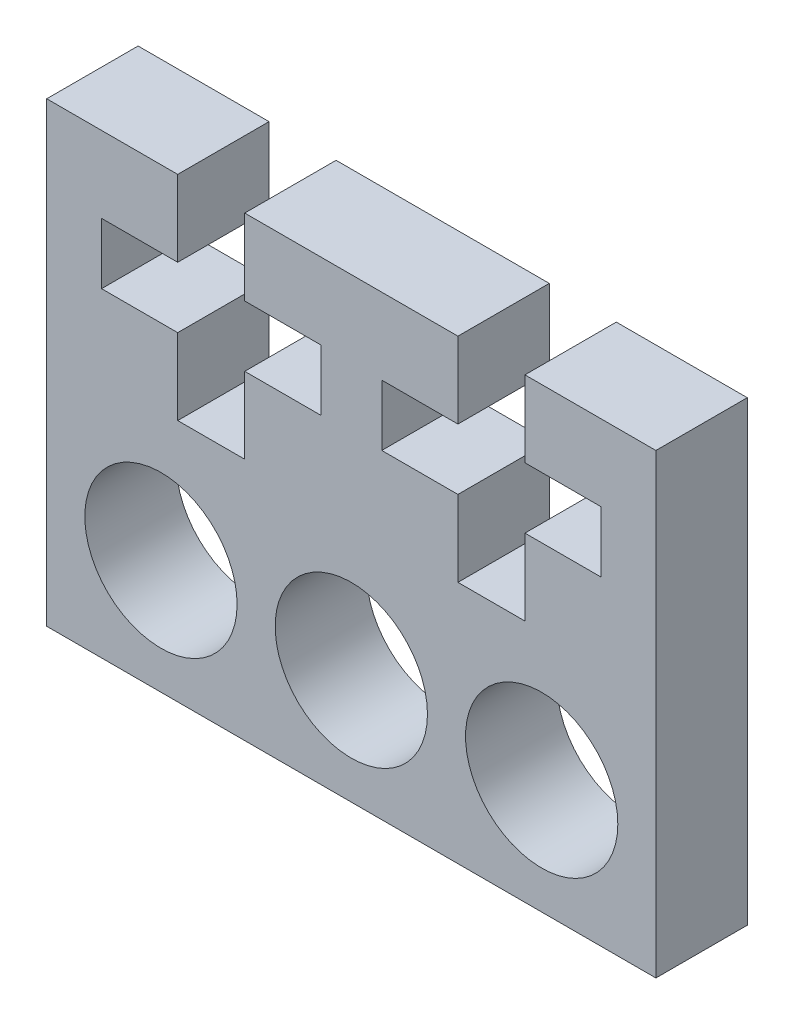
ISO-10303-21;
HEADER;
FILE_DESCRIPTION(('STEP AP214'),'2;1');
FILE_NAME('part.step','',(''),(''),'','','');
FILE_SCHEMA(('AUTOMOTIVE_DESIGN { 1 0 10303 214 1 1 1 1 }'));
ENDSEC;
DATA;
#1=APPLICATION_CONTEXT('core data for automotive mechanical design processes');
#2=APPLICATION_PROTOCOL_DEFINITION('international standard','automotive_design',2000,#1);
#3=PRODUCT_CONTEXT('',#1,'mechanical');
#4=PRODUCT('Part','Part','',(#3));
#5=PRODUCT_RELATED_PRODUCT_CATEGORY('part','',(#4));
#6=PRODUCT_DEFINITION_FORMATION('','',#4);
#7=PRODUCT_DEFINITION_CONTEXT('part definition',#1,'design');
#8=PRODUCT_DEFINITION('design','',#6,#7);
#9=PRODUCT_DEFINITION_SHAPE('','',#8);
#10=(LENGTH_UNIT() NAMED_UNIT(*) SI_UNIT(.MILLI.,.METRE.));
#11=(NAMED_UNIT(*) PLANE_ANGLE_UNIT() SI_UNIT($,.RADIAN.));
#12=(NAMED_UNIT(*) SI_UNIT($,.STERADIAN.) SOLID_ANGLE_UNIT());
#13=UNCERTAINTY_MEASURE_WITH_UNIT(LENGTH_MEASURE(1.E-05),#10,'distance_accuracy_value','');
#14=(GEOMETRIC_REPRESENTATION_CONTEXT(3) GLOBAL_UNCERTAINTY_ASSIGNED_CONTEXT((#13)) GLOBAL_UNIT_ASSIGNED_CONTEXT((#10,
#11,#12)) REPRESENTATION_CONTEXT('',''));
#15=CARTESIAN_POINT('',(0.,0.,0.));
#16=DIRECTION('',(0.,0.,1.));
#17=DIRECTION('',(1.,0.,0.));
#18=AXIS2_PLACEMENT_3D('',#15,#16,#17);
#19=CARTESIAN_POINT('',(0.,7.50000000000001,3.));
#20=DIRECTION('',(0.,1.,0.));
#21=DIRECTION('',(-1.,0.,0.));
#22=AXIS2_PLACEMENT_3D('',#19,#20,#21);
#23=PLANE('',#22);
#24=DIRECTION('',(1.,0.,0.));
#25=VECTOR('',#24,1.);
#26=CARTESIAN_POINT('',(0.,7.50000000000001,0.));
#27=LINE('',#26,#25);
#28=CARTESIAN_POINT('',(5.7,7.5,0.));
#29=VERTEX_POINT('',#28);
#30=CARTESIAN_POINT('',(10.,7.5,0.));
#31=VERTEX_POINT('',#30);
#32=EDGE_CURVE('E263',#29,#31,#27,.T.);
#33=ORIENTED_EDGE('',*,*,#32,.F.);
#34=DIRECTION('',(0.,0.,-1.));
#35=VECTOR('',#34,1.);
#36=CARTESIAN_POINT('',(5.7,7.5,3.));
#37=LINE('',#36,#35);
#38=CARTESIAN_POINT('',(5.7,7.5,3.));
#39=VERTEX_POINT('',#38);
#40=EDGE_CURVE('E11',#39,#29,#37,.T.);
#41=ORIENTED_EDGE('',*,*,#40,.F.);
#42=DIRECTION('',(1.,0.,0.));
#43=VECTOR('',#42,1.);
#44=CARTESIAN_POINT('',(0.,7.50000000000001,3.));
#45=LINE('',#44,#43);
#46=CARTESIAN_POINT('',(10.,7.5,3.));
#47=VERTEX_POINT('',#46);
#48=EDGE_CURVE('E830',#39,#47,#45,.T.);
#49=ORIENTED_EDGE('',*,*,#48,.T.);
#50=DIRECTION('',(0.,0.,-1.));
#51=VECTOR('',#50,1.);
#52=CARTESIAN_POINT('',(10.,7.5,3.));
#53=LINE('',#52,#51);
#54=EDGE_CURVE('E147',#47,#31,#53,.T.);
#55=ORIENTED_EDGE('',*,*,#54,.T.);
#56=EDGE_LOOP('',(#33,#41,#49,#55));
#57=FACE_BOUND('',#56,.T.);
#58=ADVANCED_FACE('F35',(#57),#23,.T.);
#59=CARTESIAN_POINT('',(5.7,0.,3.));
#60=DIRECTION('',(1.,0.,0.));
#61=DIRECTION('',(0.,0.,-1.));
#62=AXIS2_PLACEMENT_3D('',#59,#60,#61);
#63=PLANE('',#62);
#64=DIRECTION('',(0.,-1.,0.));
#65=VECTOR('',#64,1.);
#66=CARTESIAN_POINT('',(5.7,0.,0.));
#67=LINE('',#66,#65);
#68=CARTESIAN_POINT('',(5.7,5.,0.));
#69=VERTEX_POINT('',#68);
#70=EDGE_CURVE('E265',#29,#69,#67,.T.);
#71=ORIENTED_EDGE('',*,*,#70,.T.);
#72=DIRECTION('',(0.,0.,-1.));
#73=VECTOR('',#72,1.);
#74=CARTESIAN_POINT('',(5.7,5.,3.));
#75=LINE('',#74,#73);
#76=CARTESIAN_POINT('',(5.7,5.,3.));
#77=VERTEX_POINT('',#76);
#78=EDGE_CURVE('E44',#77,#69,#75,.T.);
#79=ORIENTED_EDGE('',*,*,#78,.F.);
#80=DIRECTION('',(0.,-1.,0.));
#81=VECTOR('',#80,1.);
#82=CARTESIAN_POINT('',(5.7,0.,3.));
#83=LINE('',#82,#81);
#84=EDGE_CURVE('E743',#39,#77,#83,.T.);
#85=ORIENTED_EDGE('',*,*,#84,.F.);
#86=ORIENTED_EDGE('',*,*,#40,.T.);
#87=EDGE_LOOP('',(#71,#79,#85,#86));
#88=FACE_BOUND('',#87,.T.);
#89=ADVANCED_FACE('F407',(#88),#63,.F.);
#90=CARTESIAN_POINT('',(0.,5.,3.));
#91=DIRECTION('',(0.,1.,0.));
#92=DIRECTION('',(0.,0.,1.));
#93=AXIS2_PLACEMENT_3D('',#90,#91,#92);
#94=PLANE('',#93);
#95=DIRECTION('',(1.,0.,0.));
#96=VECTOR('',#95,1.);
#97=CARTESIAN_POINT('',(0.,5.,0.));
#98=LINE('',#97,#96);
#99=CARTESIAN_POINT('',(8.2,5.,0.));
#100=VERTEX_POINT('',#99);
#101=EDGE_CURVE('E268',#69,#100,#98,.T.);
#102=ORIENTED_EDGE('',*,*,#101,.T.);
#103=DIRECTION('',(0.,0.,-1.));
#104=VECTOR('',#103,1.);
#105=CARTESIAN_POINT('',(8.2,5.,3.));
#106=LINE('',#105,#104);
#107=CARTESIAN_POINT('',(8.2,5.,3.));
#108=VERTEX_POINT('',#107);
#109=EDGE_CURVE('E395',#108,#100,#106,.T.);
#110=ORIENTED_EDGE('',*,*,#109,.F.);
#111=DIRECTION('',(1.,0.,0.));
#112=VECTOR('',#111,1.);
#113=CARTESIAN_POINT('',(0.,5.,3.));
#114=LINE('',#113,#112);
#115=EDGE_CURVE('E403',#77,#108,#114,.T.);
#116=ORIENTED_EDGE('',*,*,#115,.F.);
#117=ORIENTED_EDGE('',*,*,#78,.T.);
#118=EDGE_LOOP('',(#102,#110,#116,#117));
#119=FACE_BOUND('',#118,.T.);
#120=ADVANCED_FACE('F400',(#119),#94,.F.);
#121=CARTESIAN_POINT('',(8.2,0.,3.));
#122=DIRECTION('',(1.,0.,0.));
#123=DIRECTION('',(0.,0.,-1.));
#124=AXIS2_PLACEMENT_3D('',#121,#122,#123);
#125=PLANE('',#124);
#126=DIRECTION('',(0.,-1.,0.));
#127=VECTOR('',#126,1.);
#128=CARTESIAN_POINT('',(8.2,0.,0.));
#129=LINE('',#128,#127);
#130=CARTESIAN_POINT('',(8.2,3.,0.));
#131=VERTEX_POINT('',#130);
#132=EDGE_CURVE('E271',#100,#131,#129,.T.);
#133=ORIENTED_EDGE('',*,*,#132,.T.);
#134=DIRECTION('',(0.,0.,-1.));
#135=VECTOR('',#134,1.);
#136=CARTESIAN_POINT('',(8.2,3.,3.));
#137=LINE('',#136,#135);
#138=CARTESIAN_POINT('',(8.2,3.,3.));
#139=VERTEX_POINT('',#138);
#140=EDGE_CURVE('E392',#139,#131,#137,.T.);
#141=ORIENTED_EDGE('',*,*,#140,.F.);
#142=DIRECTION('',(0.,-1.,0.));
#143=VECTOR('',#142,1.);
#144=CARTESIAN_POINT('',(8.2,0.,3.));
#145=LINE('',#144,#143);
#146=EDGE_CURVE('E740',#108,#139,#145,.T.);
#147=ORIENTED_EDGE('',*,*,#146,.F.);
#148=ORIENTED_EDGE('',*,*,#109,.T.);
#149=EDGE_LOOP('',(#133,#141,#147,#148));
#150=FACE_BOUND('',#149,.T.);
#151=ADVANCED_FACE('F536',(#150),#125,.F.);
#152=CARTESIAN_POINT('',(0.,3.,3.));
#153=DIRECTION('',(0.,-1.,0.));
#154=DIRECTION('',(0.,0.,-1.));
#155=AXIS2_PLACEMENT_3D('',#152,#153,#154);
#156=PLANE('',#155);
#157=DIRECTION('',(-1.,0.,0.));
#158=VECTOR('',#157,1.);
#159=CARTESIAN_POINT('',(0.,3.,0.));
#160=LINE('',#159,#158);
#161=CARTESIAN_POINT('',(5.7,3.,0.));
#162=VERTEX_POINT('',#161);
#163=EDGE_CURVE('E274',#131,#162,#160,.T.);
#164=ORIENTED_EDGE('',*,*,#163,.T.);
#165=DIRECTION('',(0.,0.,-1.));
#166=VECTOR('',#165,1.);
#167=CARTESIAN_POINT('',(5.7,3.,3.));
#168=LINE('',#167,#166);
#169=CARTESIAN_POINT('',(5.7,3.,3.));
#170=VERTEX_POINT('',#169);
#171=EDGE_CURVE('E389',#170,#162,#168,.T.);
#172=ORIENTED_EDGE('',*,*,#171,.F.);
#173=DIRECTION('',(-1.,0.,0.));
#174=VECTOR('',#173,1.);
#175=CARTESIAN_POINT('',(0.,3.,3.));
#176=LINE('',#175,#174);
#177=EDGE_CURVE('E736',#139,#170,#176,.T.);
#178=ORIENTED_EDGE('',*,*,#177,.F.);
#179=ORIENTED_EDGE('',*,*,#140,.T.);
#180=EDGE_LOOP('',(#164,#172,#178,#179));
#181=FACE_BOUND('',#180,.T.);
#182=ADVANCED_FACE('F532',(#181),#156,.F.);
#183=CARTESIAN_POINT('',(5.7,0.,3.));
#184=DIRECTION('',(1.,0.,0.));
#185=DIRECTION('',(0.,0.,-1.));
#186=AXIS2_PLACEMENT_3D('',#183,#184,#185);
#187=PLANE('',#186);
#188=DIRECTION('',(0.,-1.,0.));
#189=VECTOR('',#188,1.);
#190=CARTESIAN_POINT('',(5.7,0.,0.));
#191=LINE('',#190,#189);
#192=CARTESIAN_POINT('',(5.7,0.500000000000003,0.));
#193=VERTEX_POINT('',#192);
#194=EDGE_CURVE('E277',#162,#193,#191,.T.);
#195=ORIENTED_EDGE('',*,*,#194,.T.);
#196=DIRECTION('',(0.,0.,-1.));
#197=VECTOR('',#196,1.);
#198=CARTESIAN_POINT('',(5.7,0.500000000000003,3.));
#199=LINE('',#198,#197);
#200=CARTESIAN_POINT('',(5.7,0.500000000000003,3.));
#201=VERTEX_POINT('',#200);
#202=EDGE_CURVE('E386',#201,#193,#199,.T.);
#203=ORIENTED_EDGE('',*,*,#202,.F.);
#204=DIRECTION('',(0.,-1.,0.));
#205=VECTOR('',#204,1.);
#206=CARTESIAN_POINT('',(5.7,0.,3.));
#207=LINE('',#206,#205);
#208=EDGE_CURVE('E739',#170,#201,#207,.T.);
#209=ORIENTED_EDGE('',*,*,#208,.F.);
#210=ORIENTED_EDGE('',*,*,#171,.T.);
#211=EDGE_LOOP('',(#195,#203,#209,#210));
#212=FACE_BOUND('',#211,.T.);
#213=ADVANCED_FACE('F528',(#212),#187,.F.);
#214=CARTESIAN_POINT('',(0.,0.499999999999998,3.));
#215=DIRECTION('',(0.,-1.,0.));
#216=DIRECTION('',(1.,0.,0.));
#217=AXIS2_PLACEMENT_3D('',#214,#215,#216);
#218=PLANE('',#217);
#219=DIRECTION('',(-1.,0.,0.));
#220=VECTOR('',#219,1.);
#221=CARTESIAN_POINT('',(0.,0.499999999999998,0.));
#222=LINE('',#221,#220);
#223=CARTESIAN_POINT('',(3.50000000000001,0.500000000000001,0.));
#224=VERTEX_POINT('',#223);
#225=EDGE_CURVE('E280',#193,#224,#222,.T.);
#226=ORIENTED_EDGE('',*,*,#225,.T.);
#227=DIRECTION('',(0.,0.,-1.));
#228=VECTOR('',#227,1.);
#229=CARTESIAN_POINT('',(3.50000000000001,0.500000000000001,3.));
#230=LINE('',#229,#228);
#231=CARTESIAN_POINT('',(3.50000000000001,0.500000000000001,3.));
#232=VERTEX_POINT('',#231);
#233=EDGE_CURVE('E383',#232,#224,#230,.T.);
#234=ORIENTED_EDGE('',*,*,#233,.F.);
#235=DIRECTION('',(-1.,0.,0.));
#236=VECTOR('',#235,1.);
#237=CARTESIAN_POINT('',(0.,0.499999999999998,3.));
#238=LINE('',#237,#236);
#239=EDGE_CURVE('E748',#201,#232,#238,.T.);
#240=ORIENTED_EDGE('',*,*,#239,.F.);
#241=ORIENTED_EDGE('',*,*,#202,.T.);
#242=EDGE_LOOP('',(#226,#234,#240,#241));
#243=FACE_BOUND('',#242,.T.);
#244=ADVANCED_FACE('F524',(#243),#218,.F.);
#245=CARTESIAN_POINT('',(3.50000000000001,0.,3.));
#246=DIRECTION('',(-1.,0.,0.));
#247=DIRECTION('',(0.,-1.,0.));
#248=AXIS2_PLACEMENT_3D('',#245,#246,#247);
#249=PLANE('',#248);
#250=DIRECTION('',(0.,1.,0.));
#251=VECTOR('',#250,1.);
#252=CARTESIAN_POINT('',(3.50000000000001,0.,0.));
#253=LINE('',#252,#251);
#254=CARTESIAN_POINT('',(3.5,3.,0.));
#255=VERTEX_POINT('',#254);
#256=EDGE_CURVE('E283',#224,#255,#253,.T.);
#257=ORIENTED_EDGE('',*,*,#256,.T.);
#258=DIRECTION('',(0.,0.,-1.));
#259=VECTOR('',#258,1.);
#260=CARTESIAN_POINT('',(3.5,3.,3.));
#261=LINE('',#260,#259);
#262=CARTESIAN_POINT('',(3.5,3.,3.));
#263=VERTEX_POINT('',#262);
#264=EDGE_CURVE('E380',#263,#255,#261,.T.);
#265=ORIENTED_EDGE('',*,*,#264,.F.);
#266=DIRECTION('',(0.,1.,0.));
#267=VECTOR('',#266,1.);
#268=CARTESIAN_POINT('',(3.50000000000001,0.,3.));
#269=LINE('',#268,#267);
#270=EDGE_CURVE('E751',#232,#263,#269,.T.);
#271=ORIENTED_EDGE('',*,*,#270,.F.);
#272=ORIENTED_EDGE('',*,*,#233,.T.);
#273=EDGE_LOOP('',(#257,#265,#271,#272));
#274=FACE_BOUND('',#273,.T.);
#275=ADVANCED_FACE('F520',(#274),#249,.F.);
#276=CARTESIAN_POINT('',(0.,3.,3.));
#277=DIRECTION('',(0.,-1.,0.));
#278=DIRECTION('',(0.,0.,-1.));
#279=AXIS2_PLACEMENT_3D('',#276,#277,#278);
#280=PLANE('',#279);
#281=DIRECTION('',(-1.,0.,0.));
#282=VECTOR('',#281,1.);
#283=CARTESIAN_POINT('',(0.,3.,0.));
#284=LINE('',#283,#282);
#285=CARTESIAN_POINT('',(1.,3.,0.));
#286=VERTEX_POINT('',#285);
#287=EDGE_CURVE('E286',#255,#286,#284,.T.);
#288=ORIENTED_EDGE('',*,*,#287,.T.);
#289=DIRECTION('',(0.,0.,-1.));
#290=VECTOR('',#289,1.);
#291=CARTESIAN_POINT('',(1.,3.,3.));
#292=LINE('',#291,#290);
#293=CARTESIAN_POINT('',(1.,3.,3.));
#294=VERTEX_POINT('',#293);
#295=EDGE_CURVE('E377',#294,#286,#292,.T.);
#296=ORIENTED_EDGE('',*,*,#295,.F.);
#297=DIRECTION('',(-1.,0.,0.));
#298=VECTOR('',#297,1.);
#299=CARTESIAN_POINT('',(0.,3.,3.));
#300=LINE('',#299,#298);
#301=EDGE_CURVE('E754',#263,#294,#300,.T.);
#302=ORIENTED_EDGE('',*,*,#301,.F.);
#303=ORIENTED_EDGE('',*,*,#264,.T.);
#304=EDGE_LOOP('',(#288,#296,#302,#303));
#305=FACE_BOUND('',#304,.T.);
#306=ADVANCED_FACE('F516',(#305),#280,.F.);
#307=CARTESIAN_POINT('',(1.,0.,3.));
#308=DIRECTION('',(-1.,0.,0.));
#309=DIRECTION('',(0.,-1.,0.));
#310=AXIS2_PLACEMENT_3D('',#307,#308,#309);
#311=PLANE('',#310);
#312=DIRECTION('',(0.,1.,0.));
#313=VECTOR('',#312,1.);
#314=CARTESIAN_POINT('',(1.,0.,0.));
#315=LINE('',#314,#313);
#316=CARTESIAN_POINT('',(1.,5.,0.));
#317=VERTEX_POINT('',#316);
#318=EDGE_CURVE('E289',#286,#317,#315,.T.);
#319=ORIENTED_EDGE('',*,*,#318,.T.);
#320=DIRECTION('',(0.,0.,-1.));
#321=VECTOR('',#320,1.);
#322=CARTESIAN_POINT('',(1.,5.,3.));
#323=LINE('',#322,#321);
#324=CARTESIAN_POINT('',(1.,5.,3.));
#325=VERTEX_POINT('',#324);
#326=EDGE_CURVE('E374',#325,#317,#323,.T.);
#327=ORIENTED_EDGE('',*,*,#326,.F.);
#328=DIRECTION('',(0.,1.,0.));
#329=VECTOR('',#328,1.);
#330=CARTESIAN_POINT('',(1.,0.,3.));
#331=LINE('',#330,#329);
#332=EDGE_CURVE('E757',#294,#325,#331,.T.);
#333=ORIENTED_EDGE('',*,*,#332,.F.);
#334=ORIENTED_EDGE('',*,*,#295,.T.);
#335=EDGE_LOOP('',(#319,#327,#333,#334));
#336=FACE_BOUND('',#335,.T.);
#337=ADVANCED_FACE('F512',(#336),#311,.F.);
#338=CARTESIAN_POINT('',(0.,5.,3.));
#339=DIRECTION('',(0.,1.,0.));
#340=DIRECTION('',(-1.,0.,0.));
#341=AXIS2_PLACEMENT_3D('',#338,#339,#340);
#342=PLANE('',#341);
#343=DIRECTION('',(1.,0.,0.));
#344=VECTOR('',#343,1.);
#345=CARTESIAN_POINT('',(0.,5.,0.));
#346=LINE('',#345,#344);
#347=CARTESIAN_POINT('',(3.5,5.,0.));
#348=VERTEX_POINT('',#347);
#349=EDGE_CURVE('E292',#317,#348,#346,.T.);
#350=ORIENTED_EDGE('',*,*,#349,.T.);
#351=DIRECTION('',(0.,0.,-1.));
#352=VECTOR('',#351,1.);
#353=CARTESIAN_POINT('',(3.5,5.,3.));
#354=LINE('',#353,#352);
#355=CARTESIAN_POINT('',(3.5,5.,3.));
#356=VERTEX_POINT('',#355);
#357=EDGE_CURVE('E371',#356,#348,#354,.T.);
#358=ORIENTED_EDGE('',*,*,#357,.F.);
#359=DIRECTION('',(1.,0.,0.));
#360=VECTOR('',#359,1.);
#361=CARTESIAN_POINT('',(0.,5.,3.));
#362=LINE('',#361,#360);
#363=EDGE_CURVE('E760',#325,#356,#362,.T.);
#364=ORIENTED_EDGE('',*,*,#363,.F.);
#365=ORIENTED_EDGE('',*,*,#326,.T.);
#366=EDGE_LOOP('',(#350,#358,#364,#365));
#367=FACE_BOUND('',#366,.T.);
#368=ADVANCED_FACE('F508',(#367),#342,.F.);
#369=CARTESIAN_POINT('',(3.5,0.,3.));
#370=DIRECTION('',(-1.,0.,0.));
#371=DIRECTION('',(0.,-1.,0.));
#372=AXIS2_PLACEMENT_3D('',#369,#370,#371);
#373=PLANE('',#372);
#374=DIRECTION('',(0.,1.,0.));
#375=VECTOR('',#374,1.);
#376=CARTESIAN_POINT('',(3.5,0.,0.));
#377=LINE('',#376,#375);
#378=CARTESIAN_POINT('',(3.5,7.5,0.));
#379=VERTEX_POINT('',#378);
#380=EDGE_CURVE('E295',#348,#379,#377,.T.);
#381=ORIENTED_EDGE('',*,*,#380,.T.);
#382=DIRECTION('',(0.,0.,-1.));
#383=VECTOR('',#382,1.);
#384=CARTESIAN_POINT('',(3.5,7.5,3.));
#385=LINE('',#384,#383);
#386=CARTESIAN_POINT('',(3.5,7.5,3.));
#387=VERTEX_POINT('',#386);
#388=EDGE_CURVE('E369',#387,#379,#385,.T.);
#389=ORIENTED_EDGE('',*,*,#388,.F.);
#390=DIRECTION('',(0.,1.,0.));
#391=VECTOR('',#390,1.);
#392=CARTESIAN_POINT('',(3.5,0.,3.));
#393=LINE('',#392,#391);
#394=EDGE_CURVE('E763',#356,#387,#393,.T.);
#395=ORIENTED_EDGE('',*,*,#394,.F.);
#396=ORIENTED_EDGE('',*,*,#357,.T.);
#397=EDGE_LOOP('',(#381,#389,#395,#396));
#398=FACE_BOUND('',#397,.T.);
#399=ADVANCED_FACE('F504',(#398),#373,.F.);
#400=CARTESIAN_POINT('',(0.,7.5,3.));
#401=DIRECTION('',(0.,1.,0.));
#402=DIRECTION('',(-1.,0.,0.));
#403=AXIS2_PLACEMENT_3D('',#400,#401,#402);
#404=PLANE('',#403);
#405=DIRECTION('',(1.,0.,0.));
#406=VECTOR('',#405,1.);
#407=CARTESIAN_POINT('',(0.,7.5,0.));
#408=LINE('',#407,#406);
#409=CARTESIAN_POINT('',(-3.5,7.5,0.));
#410=VERTEX_POINT('',#409);
#411=EDGE_CURVE('E298',#410,#379,#408,.T.);
#412=ORIENTED_EDGE('',*,*,#411,.F.);
#413=DIRECTION('',(0.,0.,-1.));
#414=VECTOR('',#413,1.);
#415=CARTESIAN_POINT('',(-3.5,7.5,3.));
#416=LINE('',#415,#414);
#417=CARTESIAN_POINT('',(-3.5,7.5,3.));
#418=VERTEX_POINT('',#417);
#419=EDGE_CURVE('E367',#418,#410,#416,.T.);
#420=ORIENTED_EDGE('',*,*,#419,.F.);
#421=DIRECTION('',(1.,0.,0.));
#422=VECTOR('',#421,1.);
#423=CARTESIAN_POINT('',(0.,7.5,3.));
#424=LINE('',#423,#422);
#425=EDGE_CURVE('E765',#418,#387,#424,.T.);
#426=ORIENTED_EDGE('',*,*,#425,.T.);
#427=ORIENTED_EDGE('',*,*,#388,.T.);
#428=EDGE_LOOP('',(#412,#420,#426,#427));
#429=FACE_BOUND('',#428,.T.);
#430=ADVANCED_FACE('F500',(#429),#404,.T.);
#431=CARTESIAN_POINT('',(-3.5,0.,3.));
#432=DIRECTION('',(-1.,0.,0.));
#433=DIRECTION('',(0.,0.,1.));
#434=AXIS2_PLACEMENT_3D('',#431,#432,#433);
#435=PLANE('',#434);
#436=DIRECTION('',(0.,1.,0.));
#437=VECTOR('',#436,1.);
#438=CARTESIAN_POINT('',(-3.5,0.,0.));
#439=LINE('',#438,#437);
#440=CARTESIAN_POINT('',(-3.5,5.,0.));
#441=VERTEX_POINT('',#440);
#442=EDGE_CURVE('E301',#441,#410,#439,.T.);
#443=ORIENTED_EDGE('',*,*,#442,.F.);
#444=DIRECTION('',(0.,0.,-1.));
#445=VECTOR('',#444,1.);
#446=CARTESIAN_POINT('',(-3.5,5.,3.));
#447=LINE('',#446,#445);
#448=CARTESIAN_POINT('',(-3.5,5.,3.));
#449=VERTEX_POINT('',#448);
#450=EDGE_CURVE('E365',#449,#441,#447,.T.);
#451=ORIENTED_EDGE('',*,*,#450,.F.);
#452=DIRECTION('',(0.,1.,0.));
#453=VECTOR('',#452,1.);
#454=CARTESIAN_POINT('',(-3.5,0.,3.));
#455=LINE('',#454,#453);
#456=EDGE_CURVE('E768',#449,#418,#455,.T.);
#457=ORIENTED_EDGE('',*,*,#456,.T.);
#458=ORIENTED_EDGE('',*,*,#419,.T.);
#459=EDGE_LOOP('',(#443,#451,#457,#458));
#460=FACE_BOUND('',#459,.T.);
#461=ADVANCED_FACE('F496',(#460),#435,.T.);
#462=CARTESIAN_POINT('',(0.,5.,3.));
#463=DIRECTION('',(0.,-1.,0.));
#464=DIRECTION('',(0.,0.,-1.));
#465=AXIS2_PLACEMENT_3D('',#462,#463,#464);
#466=PLANE('',#465);
#467=DIRECTION('',(-1.,0.,0.));
#468=VECTOR('',#467,1.);
#469=CARTESIAN_POINT('',(0.,5.,0.));
#470=LINE('',#469,#468);
#471=CARTESIAN_POINT('',(-1.,5.,0.));
#472=VERTEX_POINT('',#471);
#473=EDGE_CURVE('E304',#472,#441,#470,.T.);
#474=ORIENTED_EDGE('',*,*,#473,.F.);
#475=DIRECTION('',(0.,0.,-1.));
#476=VECTOR('',#475,1.);
#477=CARTESIAN_POINT('',(-1.,5.,3.));
#478=LINE('',#477,#476);
#479=CARTESIAN_POINT('',(-1.,5.,3.));
#480=VERTEX_POINT('',#479);
#481=EDGE_CURVE('E363',#480,#472,#478,.T.);
#482=ORIENTED_EDGE('',*,*,#481,.F.);
#483=DIRECTION('',(-1.,0.,0.));
#484=VECTOR('',#483,1.);
#485=CARTESIAN_POINT('',(0.,5.,3.));
#486=LINE('',#485,#484);
#487=EDGE_CURVE('E771',#480,#449,#486,.T.);
#488=ORIENTED_EDGE('',*,*,#487,.T.);
#489=ORIENTED_EDGE('',*,*,#450,.T.);
#490=EDGE_LOOP('',(#474,#482,#488,#489));
#491=FACE_BOUND('',#490,.T.);
#492=ADVANCED_FACE('F492',(#491),#466,.T.);
#493=CARTESIAN_POINT('',(-1.,0.,3.));
#494=DIRECTION('',(-1.,0.,0.));
#495=DIRECTION('',(0.,0.,1.));
#496=AXIS2_PLACEMENT_3D('',#493,#494,#495);
#497=PLANE('',#496);
#498=DIRECTION('',(0.,1.,0.));
#499=VECTOR('',#498,1.);
#500=CARTESIAN_POINT('',(-1.,0.,0.));
#501=LINE('',#500,#499);
#502=CARTESIAN_POINT('',(-1.,3.,0.));
#503=VERTEX_POINT('',#502);
#504=EDGE_CURVE('E307',#503,#472,#501,.T.);
#505=ORIENTED_EDGE('',*,*,#504,.F.);
#506=DIRECTION('',(0.,0.,-1.));
#507=VECTOR('',#506,1.);
#508=CARTESIAN_POINT('',(-1.,3.,3.));
#509=LINE('',#508,#507);
#510=CARTESIAN_POINT('',(-1.,3.,3.));
#511=VERTEX_POINT('',#510);
#512=EDGE_CURVE('E361',#511,#503,#509,.T.);
#513=ORIENTED_EDGE('',*,*,#512,.F.);
#514=DIRECTION('',(0.,1.,0.));
#515=VECTOR('',#514,1.);
#516=CARTESIAN_POINT('',(-1.,0.,3.));
#517=LINE('',#516,#515);
#518=EDGE_CURVE('E774',#511,#480,#517,.T.);
#519=ORIENTED_EDGE('',*,*,#518,.T.);
#520=ORIENTED_EDGE('',*,*,#481,.T.);
#521=EDGE_LOOP('',(#505,#513,#519,#520));
#522=FACE_BOUND('',#521,.T.);
#523=ADVANCED_FACE('F488',(#522),#497,.T.);
#524=CARTESIAN_POINT('',(0.,3.,3.));
#525=DIRECTION('',(0.,1.,0.));
#526=DIRECTION('',(0.,0.,1.));
#527=AXIS2_PLACEMENT_3D('',#524,#525,#526);
#528=PLANE('',#527);
#529=DIRECTION('',(1.,0.,0.));
#530=VECTOR('',#529,1.);
#531=CARTESIAN_POINT('',(0.,3.,0.));
#532=LINE('',#531,#530);
#533=CARTESIAN_POINT('',(-3.5,3.,0.));
#534=VERTEX_POINT('',#533);
#535=EDGE_CURVE('E310',#534,#503,#532,.T.);
#536=ORIENTED_EDGE('',*,*,#535,.F.);
#537=DIRECTION('',(0.,0.,-1.));
#538=VECTOR('',#537,1.);
#539=CARTESIAN_POINT('',(-3.5,3.,3.));
#540=LINE('',#539,#538);
#541=CARTESIAN_POINT('',(-3.5,3.,3.));
#542=VERTEX_POINT('',#541);
#543=EDGE_CURVE('E359',#542,#534,#540,.T.);
#544=ORIENTED_EDGE('',*,*,#543,.F.);
#545=DIRECTION('',(1.,0.,0.));
#546=VECTOR('',#545,1.);
#547=CARTESIAN_POINT('',(0.,3.,3.));
#548=LINE('',#547,#546);
#549=EDGE_CURVE('E777',#542,#511,#548,.T.);
#550=ORIENTED_EDGE('',*,*,#549,.T.);
#551=ORIENTED_EDGE('',*,*,#512,.T.);
#552=EDGE_LOOP('',(#536,#544,#550,#551));
#553=FACE_BOUND('',#552,.T.);
#554=ADVANCED_FACE('F484',(#553),#528,.T.);
#555=CARTESIAN_POINT('',(-3.5,0.,3.));
#556=DIRECTION('',(-1.,0.,0.));
#557=DIRECTION('',(0.,0.,1.));
#558=AXIS2_PLACEMENT_3D('',#555,#556,#557);
#559=PLANE('',#558);
#560=DIRECTION('',(0.,1.,0.));
#561=VECTOR('',#560,1.);
#562=CARTESIAN_POINT('',(-3.5,0.,0.));
#563=LINE('',#562,#561);
#564=CARTESIAN_POINT('',(-3.5,0.500000000000001,0.));
#565=VERTEX_POINT('',#564);
#566=EDGE_CURVE('E313',#565,#534,#563,.T.);
#567=ORIENTED_EDGE('',*,*,#566,.F.);
#568=DIRECTION('',(0.,0.,-1.));
#569=VECTOR('',#568,1.);
#570=CARTESIAN_POINT('',(-3.5,0.500000000000001,3.));
#571=LINE('',#570,#569);
#572=CARTESIAN_POINT('',(-3.5,0.500000000000001,3.));
#573=VERTEX_POINT('',#572);
#574=EDGE_CURVE('E357',#573,#565,#571,.T.);
#575=ORIENTED_EDGE('',*,*,#574,.F.);
#576=DIRECTION('',(0.,1.,0.));
#577=VECTOR('',#576,1.);
#578=CARTESIAN_POINT('',(-3.5,0.,3.));
#579=LINE('',#578,#577);
#580=EDGE_CURVE('E780',#573,#542,#579,.T.);
#581=ORIENTED_EDGE('',*,*,#580,.T.);
#582=ORIENTED_EDGE('',*,*,#543,.T.);
#583=EDGE_LOOP('',(#567,#575,#581,#582));
#584=FACE_BOUND('',#583,.T.);
#585=ADVANCED_FACE('F480',(#584),#559,.T.);
#586=CARTESIAN_POINT('',(0.,0.500000000000001,3.));
#587=DIRECTION('',(0.,1.,0.));
#588=DIRECTION('',(0.,0.,1.));
#589=AXIS2_PLACEMENT_3D('',#586,#587,#588);
#590=PLANE('',#589);
#591=DIRECTION('',(1.,0.,0.));
#592=VECTOR('',#591,1.);
#593=CARTESIAN_POINT('',(0.,0.500000000000001,0.));
#594=LINE('',#593,#592);
#595=CARTESIAN_POINT('',(-5.7,0.500000000000001,0.));
#596=VERTEX_POINT('',#595);
#597=EDGE_CURVE('E316',#596,#565,#594,.T.);
#598=ORIENTED_EDGE('',*,*,#597,.F.);
#599=DIRECTION('',(0.,0.,-1.));
#600=VECTOR('',#599,1.);
#601=CARTESIAN_POINT('',(-5.7,0.500000000000001,3.));
#602=LINE('',#601,#600);
#603=CARTESIAN_POINT('',(-5.7,0.500000000000001,3.));
#604=VERTEX_POINT('',#603);
#605=EDGE_CURVE('E355',#604,#596,#602,.T.);
#606=ORIENTED_EDGE('',*,*,#605,.F.);
#607=DIRECTION('',(1.,0.,0.));
#608=VECTOR('',#607,1.);
#609=CARTESIAN_POINT('',(0.,0.500000000000001,3.));
#610=LINE('',#609,#608);
#611=EDGE_CURVE('E783',#604,#573,#610,.T.);
#612=ORIENTED_EDGE('',*,*,#611,.T.);
#613=ORIENTED_EDGE('',*,*,#574,.T.);
#614=EDGE_LOOP('',(#598,#606,#612,#613));
#615=FACE_BOUND('',#614,.T.);
#616=ADVANCED_FACE('F476',(#615),#590,.T.);
#617=CARTESIAN_POINT('',(-5.7,0.,3.));
#618=DIRECTION('',(1.,0.,0.));
#619=DIRECTION('',(0.,0.,-1.));
#620=AXIS2_PLACEMENT_3D('',#617,#618,#619);
#621=PLANE('',#620);
#622=DIRECTION('',(0.,-1.,0.));
#623=VECTOR('',#622,1.);
#624=CARTESIAN_POINT('',(-5.7,0.,0.));
#625=LINE('',#624,#623);
#626=CARTESIAN_POINT('',(-5.7,3.,0.));
#627=VERTEX_POINT('',#626);
#628=EDGE_CURVE('E319',#627,#596,#625,.T.);
#629=ORIENTED_EDGE('',*,*,#628,.F.);
#630=DIRECTION('',(0.,0.,-1.));
#631=VECTOR('',#630,1.);
#632=CARTESIAN_POINT('',(-5.7,3.,3.));
#633=LINE('',#632,#631);
#634=CARTESIAN_POINT('',(-5.7,3.,3.));
#635=VERTEX_POINT('',#634);
#636=EDGE_CURVE('E353',#635,#627,#633,.T.);
#637=ORIENTED_EDGE('',*,*,#636,.F.);
#638=DIRECTION('',(0.,-1.,0.));
#639=VECTOR('',#638,1.);
#640=CARTESIAN_POINT('',(-5.7,0.,3.));
#641=LINE('',#640,#639);
#642=EDGE_CURVE('E786',#635,#604,#641,.T.);
#643=ORIENTED_EDGE('',*,*,#642,.T.);
#644=ORIENTED_EDGE('',*,*,#605,.T.);
#645=EDGE_LOOP('',(#629,#637,#643,#644));
#646=FACE_BOUND('',#645,.T.);
#647=ADVANCED_FACE('F472',(#646),#621,.T.);
#648=CARTESIAN_POINT('',(0.,3.,3.));
#649=DIRECTION('',(0.,1.,0.));
#650=DIRECTION('',(0.,0.,1.));
#651=AXIS2_PLACEMENT_3D('',#648,#649,#650);
#652=PLANE('',#651);
#653=DIRECTION('',(1.,0.,0.));
#654=VECTOR('',#653,1.);
#655=CARTESIAN_POINT('',(0.,3.,0.));
#656=LINE('',#655,#654);
#657=CARTESIAN_POINT('',(-8.2,3.,0.));
#658=VERTEX_POINT('',#657);
#659=EDGE_CURVE('E322',#658,#627,#656,.T.);
#660=ORIENTED_EDGE('',*,*,#659,.F.);
#661=DIRECTION('',(0.,0.,-1.));
#662=VECTOR('',#661,1.);
#663=CARTESIAN_POINT('',(-8.2,3.,3.));
#664=LINE('',#663,#662);
#665=CARTESIAN_POINT('',(-8.2,3.,3.));
#666=VERTEX_POINT('',#665);
#667=EDGE_CURVE('E351',#666,#658,#664,.T.);
#668=ORIENTED_EDGE('',*,*,#667,.F.);
#669=DIRECTION('',(1.,0.,0.));
#670=VECTOR('',#669,1.);
#671=CARTESIAN_POINT('',(0.,3.,3.));
#672=LINE('',#671,#670);
#673=EDGE_CURVE('E789',#666,#635,#672,.T.);
#674=ORIENTED_EDGE('',*,*,#673,.T.);
#675=ORIENTED_EDGE('',*,*,#636,.T.);
#676=EDGE_LOOP('',(#660,#668,#674,#675));
#677=FACE_BOUND('',#676,.T.);
#678=ADVANCED_FACE('F468',(#677),#652,.T.);
#679=CARTESIAN_POINT('',(-8.2,0.,3.));
#680=DIRECTION('',(1.,0.,0.));
#681=DIRECTION('',(0.,0.,-1.));
#682=AXIS2_PLACEMENT_3D('',#679,#680,#681);
#683=PLANE('',#682);
#684=DIRECTION('',(0.,-1.,0.));
#685=VECTOR('',#684,1.);
#686=CARTESIAN_POINT('',(-8.2,0.,0.));
#687=LINE('',#686,#685);
#688=CARTESIAN_POINT('',(-8.2,5.,0.));
#689=VERTEX_POINT('',#688);
#690=EDGE_CURVE('E325',#689,#658,#687,.T.);
#691=ORIENTED_EDGE('',*,*,#690,.F.);
#692=DIRECTION('',(0.,0.,-1.));
#693=VECTOR('',#692,1.);
#694=CARTESIAN_POINT('',(-8.2,5.,3.));
#695=LINE('',#694,#693);
#696=CARTESIAN_POINT('',(-8.2,5.,3.));
#697=VERTEX_POINT('',#696);
#698=EDGE_CURVE('E349',#697,#689,#695,.T.);
#699=ORIENTED_EDGE('',*,*,#698,.F.);
#700=DIRECTION('',(0.,-1.,0.));
#701=VECTOR('',#700,1.);
#702=CARTESIAN_POINT('',(-8.2,0.,3.));
#703=LINE('',#702,#701);
#704=EDGE_CURVE('E792',#697,#666,#703,.T.);
#705=ORIENTED_EDGE('',*,*,#704,.T.);
#706=ORIENTED_EDGE('',*,*,#667,.T.);
#707=EDGE_LOOP('',(#691,#699,#705,#706));
#708=FACE_BOUND('',#707,.T.);
#709=ADVANCED_FACE('F464',(#708),#683,.T.);
#710=CARTESIAN_POINT('',(0.,5.,3.));
#711=DIRECTION('',(0.,-1.,0.));
#712=DIRECTION('',(0.,0.,-1.));
#713=AXIS2_PLACEMENT_3D('',#710,#711,#712);
#714=PLANE('',#713);
#715=DIRECTION('',(-1.,0.,0.));
#716=VECTOR('',#715,1.);
#717=CARTESIAN_POINT('',(0.,5.,0.));
#718=LINE('',#717,#716);
#719=CARTESIAN_POINT('',(-5.7,5.,0.));
#720=VERTEX_POINT('',#719);
#721=EDGE_CURVE('E328',#720,#689,#718,.T.);
#722=ORIENTED_EDGE('',*,*,#721,.F.);
#723=DIRECTION('',(0.,0.,-1.));
#724=VECTOR('',#723,1.);
#725=CARTESIAN_POINT('',(-5.7,5.,3.));
#726=LINE('',#725,#724);
#727=CARTESIAN_POINT('',(-5.7,5.,3.));
#728=VERTEX_POINT('',#727);
#729=EDGE_CURVE('E347',#728,#720,#726,.T.);
#730=ORIENTED_EDGE('',*,*,#729,.F.);
#731=DIRECTION('',(-1.,0.,0.));
#732=VECTOR('',#731,1.);
#733=CARTESIAN_POINT('',(0.,5.,3.));
#734=LINE('',#733,#732);
#735=EDGE_CURVE('E795',#728,#697,#734,.T.);
#736=ORIENTED_EDGE('',*,*,#735,.T.);
#737=ORIENTED_EDGE('',*,*,#698,.T.);
#738=EDGE_LOOP('',(#722,#730,#736,#737));
#739=FACE_BOUND('',#738,.T.);
#740=ADVANCED_FACE('F460',(#739),#714,.T.);
#741=CARTESIAN_POINT('',(-5.7,0.,3.));
#742=DIRECTION('',(1.,0.,0.));
#743=DIRECTION('',(0.,0.,-1.));
#744=AXIS2_PLACEMENT_3D('',#741,#742,#743);
#745=PLANE('',#744);
#746=DIRECTION('',(0.,-1.,0.));
#747=VECTOR('',#746,1.);
#748=CARTESIAN_POINT('',(-5.7,0.,0.));
#749=LINE('',#748,#747);
#750=CARTESIAN_POINT('',(-5.7,7.5,0.));
#751=VERTEX_POINT('',#750);
#752=EDGE_CURVE('E331',#751,#720,#749,.T.);
#753=ORIENTED_EDGE('',*,*,#752,.F.);
#754=DIRECTION('',(0.,0.,-1.));
#755=VECTOR('',#754,1.);
#756=CARTESIAN_POINT('',(-5.7,7.5,3.));
#757=LINE('',#756,#755);
#758=CARTESIAN_POINT('',(-5.7,7.5,3.));
#759=VERTEX_POINT('',#758);
#760=EDGE_CURVE('E345',#759,#751,#757,.T.);
#761=ORIENTED_EDGE('',*,*,#760,.F.);
#762=DIRECTION('',(0.,-1.,0.));
#763=VECTOR('',#762,1.);
#764=CARTESIAN_POINT('',(-5.7,0.,3.));
#765=LINE('',#764,#763);
#766=EDGE_CURVE('E249',#759,#728,#765,.T.);
#767=ORIENTED_EDGE('',*,*,#766,.T.);
#768=ORIENTED_EDGE('',*,*,#729,.T.);
#769=EDGE_LOOP('',(#753,#761,#767,#768));
#770=FACE_BOUND('',#769,.T.);
#771=ADVANCED_FACE('F456',(#770),#745,.T.);
#772=CARTESIAN_POINT('',(0.,7.5,3.));
#773=DIRECTION('',(0.,1.,0.));
#774=DIRECTION('',(0.,0.,1.));
#775=AXIS2_PLACEMENT_3D('',#772,#773,#774);
#776=PLANE('',#775);
#777=DIRECTION('',(1.,0.,0.));
#778=VECTOR('',#777,1.);
#779=CARTESIAN_POINT('',(0.,7.5,0.));
#780=LINE('',#779,#778);
#781=CARTESIAN_POINT('',(-10.,7.5,0.));
#782=VERTEX_POINT('',#781);
#783=EDGE_CURVE('E334',#782,#751,#780,.T.);
#784=ORIENTED_EDGE('',*,*,#783,.F.);
#785=DIRECTION('',(0.,0.,-1.));
#786=VECTOR('',#785,1.);
#787=CARTESIAN_POINT('',(-10.,7.5,3.));
#788=LINE('',#787,#786);
#789=CARTESIAN_POINT('',(-10.,7.5,3.));
#790=VERTEX_POINT('',#789);
#791=EDGE_CURVE('E236',#790,#782,#788,.T.);
#792=ORIENTED_EDGE('',*,*,#791,.F.);
#793=DIRECTION('',(1.,0.,0.));
#794=VECTOR('',#793,1.);
#795=CARTESIAN_POINT('',(0.,7.5,3.));
#796=LINE('',#795,#794);
#797=EDGE_CURVE('E247',#790,#759,#796,.T.);
#798=ORIENTED_EDGE('',*,*,#797,.T.);
#799=ORIENTED_EDGE('',*,*,#760,.T.);
#800=EDGE_LOOP('',(#784,#792,#798,#799));
#801=FACE_BOUND('',#800,.T.);
#802=ADVANCED_FACE('F453',(#801),#776,.T.);
#803=CARTESIAN_POINT('',(-10.,0.,3.));
#804=DIRECTION('',(-1.,0.,0.));
#805=DIRECTION('',(0.,-1.,0.));
#806=AXIS2_PLACEMENT_3D('',#803,#804,#805);
#807=PLANE('',#806);
#808=DIRECTION('',(0.,1.,0.));
#809=VECTOR('',#808,1.);
#810=CARTESIAN_POINT('',(-10.,0.,0.));
#811=LINE('',#810,#809);
#812=CARTESIAN_POINT('',(-10.,-7.5,0.));
#813=VERTEX_POINT('',#812);
#814=EDGE_CURVE('E233',#813,#782,#811,.T.);
#815=ORIENTED_EDGE('',*,*,#814,.F.);
#816=DIRECTION('',(0.,0.,-1.));
#817=VECTOR('',#816,1.);
#818=CARTESIAN_POINT('',(-10.,-7.5,3.));
#819=LINE('',#818,#817);
#820=CARTESIAN_POINT('',(-10.,-7.5,3.));
#821=VERTEX_POINT('',#820);
#822=EDGE_CURVE('E227',#821,#813,#819,.T.);
#823=ORIENTED_EDGE('',*,*,#822,.F.);
#824=DIRECTION('',(0.,1.,0.));
#825=VECTOR('',#824,1.);
#826=CARTESIAN_POINT('',(-10.,0.,3.));
#827=LINE('',#826,#825);
#828=EDGE_CURVE('E231',#821,#790,#827,.T.);
#829=ORIENTED_EDGE('',*,*,#828,.T.);
#830=ORIENTED_EDGE('',*,*,#791,.T.);
#831=EDGE_LOOP('',(#815,#823,#829,#830));
#832=FACE_BOUND('',#831,.T.);
#833=ADVANCED_FACE('F229',(#832),#807,.T.);
#834=CARTESIAN_POINT('',(0.,-7.5,3.));
#835=DIRECTION('',(0.,1.,0.));
#836=DIRECTION('',(-1.,0.,0.));
#837=AXIS2_PLACEMENT_3D('',#834,#835,#836);
#838=PLANE('',#837);
#839=DIRECTION('',(1.,0.,0.));
#840=VECTOR('',#839,1.);
#841=CARTESIAN_POINT('',(0.,-7.5,0.));
#842=LINE('',#841,#840);
#843=CARTESIAN_POINT('',(10.,-7.5,0.));
#844=VERTEX_POINT('',#843);
#845=EDGE_CURVE('E338',#813,#844,#842,.T.);
#846=ORIENTED_EDGE('',*,*,#845,.T.);
#847=DIRECTION('',(0.,0.,-1.));
#848=VECTOR('',#847,1.);
#849=CARTESIAN_POINT('',(10.,-7.5,3.));
#850=LINE('',#849,#848);
#851=CARTESIAN_POINT('',(10.,-7.5,3.));
#852=VERTEX_POINT('',#851);
#853=EDGE_CURVE('E237',#852,#844,#850,.T.);
#854=ORIENTED_EDGE('',*,*,#853,.F.);
#855=DIRECTION('',(1.,0.,0.));
#856=VECTOR('',#855,1.);
#857=CARTESIAN_POINT('',(0.,-7.5,3.));
#858=LINE('',#857,#856);
#859=EDGE_CURVE('E240',#821,#852,#858,.T.);
#860=ORIENTED_EDGE('',*,*,#859,.F.);
#861=ORIENTED_EDGE('',*,*,#822,.T.);
#862=EDGE_LOOP('',(#846,#854,#860,#861));
#863=FACE_BOUND('',#862,.T.);
#864=ADVANCED_FACE('F241',(#863),#838,.F.);
#865=CARTESIAN_POINT('',(0.,-3.75,3.));
#866=DIRECTION('',(0.,0.,-1.));
#867=DIRECTION('',(-1.,0.,0.));
#868=AXIS2_PLACEMENT_3D('',#865,#866,#867);
#869=CYLINDRICAL_SURFACE('',#868,2.5);
#870=CARTESIAN_POINT('',(0.,-3.75,3.));
#871=DIRECTION('',(0.,0.,1.));
#872=DIRECTION('',(1.,0.,0.));
#873=AXIS2_PLACEMENT_3D('',#870,#871,#872);
#874=CIRCLE('',#873,2.5);
#875=CARTESIAN_POINT('',(2.5,-3.75,3.));
#876=VERTEX_POINT('',#875);
#877=EDGE_CURVE('E832',#876,#876,#874,.T.);
#878=ORIENTED_EDGE('',*,*,#877,.T.);
#879=EDGE_LOOP('',(#878));
#880=FACE_BOUND('',#879,.T.);
#881=CARTESIAN_POINT('',(0.,-3.75,0.));
#882=DIRECTION('',(0.,0.,1.));
#883=DIRECTION('',(1.,0.,0.));
#884=AXIS2_PLACEMENT_3D('',#881,#882,#883);
#885=CIRCLE('',#884,2.5);
#886=CARTESIAN_POINT('',(2.5,-3.75,0.));
#887=VERTEX_POINT('',#886);
#888=EDGE_CURVE('E260',#887,#887,#885,.T.);
#889=ORIENTED_EDGE('',*,*,#888,.F.);
#890=EDGE_LOOP('',(#889));
#891=FACE_BOUND('',#890,.T.);
#892=ADVANCED_FACE('F417',(#880,#891),#869,.F.);
#893=CARTESIAN_POINT('',(-6.25,-3.75,3.));
#894=DIRECTION('',(0.,0.,-1.));
#895=DIRECTION('',(-1.,0.,0.));
#896=AXIS2_PLACEMENT_3D('',#893,#894,#895);
#897=CYLINDRICAL_SURFACE('',#896,2.5);
#898=CARTESIAN_POINT('',(-6.25,-3.75,3.));
#899=DIRECTION('',(0.,0.,1.));
#900=DIRECTION('',(1.,0.,0.));
#901=AXIS2_PLACEMENT_3D('',#898,#899,#900);
#902=CIRCLE('',#901,2.5);
#903=CARTESIAN_POINT('',(-3.75,-3.75,3.));
#904=VERTEX_POINT('',#903);
#905=EDGE_CURVE('E431',#904,#904,#902,.T.);
#906=ORIENTED_EDGE('',*,*,#905,.T.);
#907=EDGE_LOOP('',(#906));
#908=FACE_BOUND('',#907,.T.);
#909=CARTESIAN_POINT('',(-6.25,-3.75,0.));
#910=DIRECTION('',(0.,0.,1.));
#911=DIRECTION('',(1.,0.,0.));
#912=AXIS2_PLACEMENT_3D('',#909,#910,#911);
#913=CIRCLE('',#912,2.5);
#914=CARTESIAN_POINT('',(-3.75,-3.75,0.));
#915=VERTEX_POINT('',#914);
#916=EDGE_CURVE('E257',#915,#915,#913,.T.);
#917=ORIENTED_EDGE('',*,*,#916,.F.);
#918=EDGE_LOOP('',(#917));
#919=FACE_BOUND('',#918,.T.);
#920=ADVANCED_FACE('F419',(#908,#919),#897,.F.);
#921=CARTESIAN_POINT('',(6.25,-3.75,3.));
#922=DIRECTION('',(0.,0.,-1.));
#923=DIRECTION('',(-1.,0.,0.));
#924=AXIS2_PLACEMENT_3D('',#921,#922,#923);
#925=CYLINDRICAL_SURFACE('',#924,2.5);
#926=CARTESIAN_POINT('',(6.25,-3.75,3.));
#927=DIRECTION('',(0.,0.,1.));
#928=DIRECTION('',(1.,0.,0.));
#929=AXIS2_PLACEMENT_3D('',#926,#927,#928);
#930=CIRCLE('',#929,2.5);
#931=CARTESIAN_POINT('',(8.75,-3.75,3.));
#932=VERTEX_POINT('',#931);
#933=EDGE_CURVE('E341',#932,#932,#930,.T.);
#934=ORIENTED_EDGE('',*,*,#933,.T.);
#935=EDGE_LOOP('',(#934));
#936=FACE_BOUND('',#935,.T.);
#937=CARTESIAN_POINT('',(6.25,-3.75,0.));
#938=DIRECTION('',(0.,0.,1.));
#939=DIRECTION('',(1.,0.,0.));
#940=AXIS2_PLACEMENT_3D('',#937,#938,#939);
#941=CIRCLE('',#940,2.5);
#942=CARTESIAN_POINT('',(8.75,-3.75,0.));
#943=VERTEX_POINT('',#942);
#944=EDGE_CURVE('E254',#943,#943,#941,.T.);
#945=ORIENTED_EDGE('',*,*,#944,.F.);
#946=EDGE_LOOP('',(#945));
#947=FACE_BOUND('',#946,.T.);
#948=ADVANCED_FACE('F37',(#936,#947),#925,.F.);
#949=CARTESIAN_POINT('',(10.,0.,3.));
#950=DIRECTION('',(-1.,0.,0.));
#951=DIRECTION('',(0.,-1.,0.));
#952=AXIS2_PLACEMENT_3D('',#949,#950,#951);
#953=PLANE('',#952);
#954=DIRECTION('',(0.,1.,0.));
#955=VECTOR('',#954,1.);
#956=CARTESIAN_POINT('',(10.,0.,0.));
#957=LINE('',#956,#955);
#958=EDGE_CURVE('E140',#844,#31,#957,.T.);
#959=ORIENTED_EDGE('',*,*,#958,.T.);
#960=ORIENTED_EDGE('',*,*,#54,.F.);
#961=DIRECTION('',(0.,1.,0.));
#962=VECTOR('',#961,1.);
#963=CARTESIAN_POINT('',(10.,0.,3.));
#964=LINE('',#963,#962);
#965=EDGE_CURVE('E52',#852,#47,#964,.T.);
#966=ORIENTED_EDGE('',*,*,#965,.F.);
#967=ORIENTED_EDGE('',*,*,#853,.T.);
#968=EDGE_LOOP('',(#959,#960,#966,#967));
#969=FACE_BOUND('',#968,.T.);
#970=ADVANCED_FACE('F426',(#969),#953,.F.);
#971=CARTESIAN_POINT('',(0.,0.,3.));
#972=DIRECTION('',(0.,0.,1.));
#973=DIRECTION('',(1.,0.,0.));
#974=AXIS2_PLACEMENT_3D('',#971,#972,#973);
#975=PLANE('',#974);
#976=ORIENTED_EDGE('',*,*,#933,.F.);
#977=EDGE_LOOP('',(#976));
#978=FACE_BOUND('',#977,.T.);
#979=ORIENTED_EDGE('',*,*,#905,.F.);
#980=EDGE_LOOP('',(#979));
#981=FACE_BOUND('',#980,.T.);
#982=ORIENTED_EDGE('',*,*,#877,.F.);
#983=EDGE_LOOP('',(#982));
#984=FACE_BOUND('',#983,.T.);
#985=ORIENTED_EDGE('',*,*,#48,.F.);
#986=ORIENTED_EDGE('',*,*,#84,.T.);
#987=ORIENTED_EDGE('',*,*,#115,.T.);
#988=ORIENTED_EDGE('',*,*,#146,.T.);
#989=ORIENTED_EDGE('',*,*,#177,.T.);
#990=ORIENTED_EDGE('',*,*,#208,.T.);
#991=ORIENTED_EDGE('',*,*,#239,.T.);
#992=ORIENTED_EDGE('',*,*,#270,.T.);
#993=ORIENTED_EDGE('',*,*,#301,.T.);
#994=ORIENTED_EDGE('',*,*,#332,.T.);
#995=ORIENTED_EDGE('',*,*,#363,.T.);
#996=ORIENTED_EDGE('',*,*,#394,.T.);
#997=ORIENTED_EDGE('',*,*,#425,.F.);
#998=ORIENTED_EDGE('',*,*,#456,.F.);
#999=ORIENTED_EDGE('',*,*,#487,.F.);
#1000=ORIENTED_EDGE('',*,*,#518,.F.);
#1001=ORIENTED_EDGE('',*,*,#549,.F.);
#1002=ORIENTED_EDGE('',*,*,#580,.F.);
#1003=ORIENTED_EDGE('',*,*,#611,.F.);
#1004=ORIENTED_EDGE('',*,*,#642,.F.);
#1005=ORIENTED_EDGE('',*,*,#673,.F.);
#1006=ORIENTED_EDGE('',*,*,#704,.F.);
#1007=ORIENTED_EDGE('',*,*,#735,.F.);
#1008=ORIENTED_EDGE('',*,*,#766,.F.);
#1009=ORIENTED_EDGE('',*,*,#797,.F.);
#1010=ORIENTED_EDGE('',*,*,#828,.F.);
#1011=ORIENTED_EDGE('',*,*,#859,.T.);
#1012=ORIENTED_EDGE('',*,*,#965,.T.);
#1013=EDGE_LOOP('',(#985,#986,#987,#988,#989,#990,#991,#992,#993,#994,#995,#996,#997,#998,#999,
#1000,#1001,#1002,#1003,#1004,#1005,#1006,#1007,#1008,#1009,#1010,#1011,#1012));
#1014=FACE_BOUND('',#1013,.T.);
#1015=ADVANCED_FACE('F244',(#978,#981,#984,#1014),#975,.T.);
#1016=CARTESIAN_POINT('',(0.,0.,0.));
#1017=DIRECTION('',(0.,0.,1.));
#1018=DIRECTION('',(1.,0.,0.));
#1019=AXIS2_PLACEMENT_3D('',#1016,#1017,#1018);
#1020=PLANE('',#1019);
#1021=ORIENTED_EDGE('',*,*,#944,.T.);
#1022=EDGE_LOOP('',(#1021));
#1023=FACE_BOUND('',#1022,.T.);
#1024=ORIENTED_EDGE('',*,*,#916,.T.);
#1025=EDGE_LOOP('',(#1024));
#1026=FACE_BOUND('',#1025,.T.);
#1027=ORIENTED_EDGE('',*,*,#888,.T.);
#1028=EDGE_LOOP('',(#1027));
#1029=FACE_BOUND('',#1028,.T.);
#1030=ORIENTED_EDGE('',*,*,#32,.T.);
#1031=ORIENTED_EDGE('',*,*,#958,.F.);
#1032=ORIENTED_EDGE('',*,*,#845,.F.);
#1033=ORIENTED_EDGE('',*,*,#814,.T.);
#1034=ORIENTED_EDGE('',*,*,#783,.T.);
#1035=ORIENTED_EDGE('',*,*,#752,.T.);
#1036=ORIENTED_EDGE('',*,*,#721,.T.);
#1037=ORIENTED_EDGE('',*,*,#690,.T.);
#1038=ORIENTED_EDGE('',*,*,#659,.T.);
#1039=ORIENTED_EDGE('',*,*,#628,.T.);
#1040=ORIENTED_EDGE('',*,*,#597,.T.);
#1041=ORIENTED_EDGE('',*,*,#566,.T.);
#1042=ORIENTED_EDGE('',*,*,#535,.T.);
#1043=ORIENTED_EDGE('',*,*,#504,.T.);
#1044=ORIENTED_EDGE('',*,*,#473,.T.);
#1045=ORIENTED_EDGE('',*,*,#442,.T.);
#1046=ORIENTED_EDGE('',*,*,#411,.T.);
#1047=ORIENTED_EDGE('',*,*,#380,.F.);
#1048=ORIENTED_EDGE('',*,*,#349,.F.);
#1049=ORIENTED_EDGE('',*,*,#318,.F.);
#1050=ORIENTED_EDGE('',*,*,#287,.F.);
#1051=ORIENTED_EDGE('',*,*,#256,.F.);
#1052=ORIENTED_EDGE('',*,*,#225,.F.);
#1053=ORIENTED_EDGE('',*,*,#194,.F.);
#1054=ORIENTED_EDGE('',*,*,#163,.F.);
#1055=ORIENTED_EDGE('',*,*,#132,.F.);
#1056=ORIENTED_EDGE('',*,*,#101,.F.);
#1057=ORIENTED_EDGE('',*,*,#70,.F.);
#1058=EDGE_LOOP('',(#1030,#1031,#1032,#1033,#1034,#1035,#1036,#1037,#1038,#1039,#1040,#1041,
#1042,#1043,#1044,#1045,#1046,#1047,#1048,#1049,#1050,#1051,#1052,#1053,#1054,#1055,#1056,#1057));
#1059=FACE_BOUND('',#1058,.T.);
#1060=ADVANCED_FACE('F408',(#1023,#1026,#1029,#1059),#1020,.F.);
#1061=CLOSED_SHELL('',(#58,#89,#120,#151,#182,#213,#244,#275,#306,#337,#368,#399,#430,#461,#492,
#523,#554,#585,#616,#647,#678,#709,#740,#771,#802,#833,#864,#892,#920,#948,#970,#1015,#1060));
#1062=MANIFOLD_SOLID_BREP('B2',#1061);
#1063=ADVANCED_BREP_SHAPE_REPRESENTATION('',(#18,#1062),#14);
#1064=SHAPE_DEFINITION_REPRESENTATION(#9,#1063);
ENDSEC;
END-ISO-10303-21;
